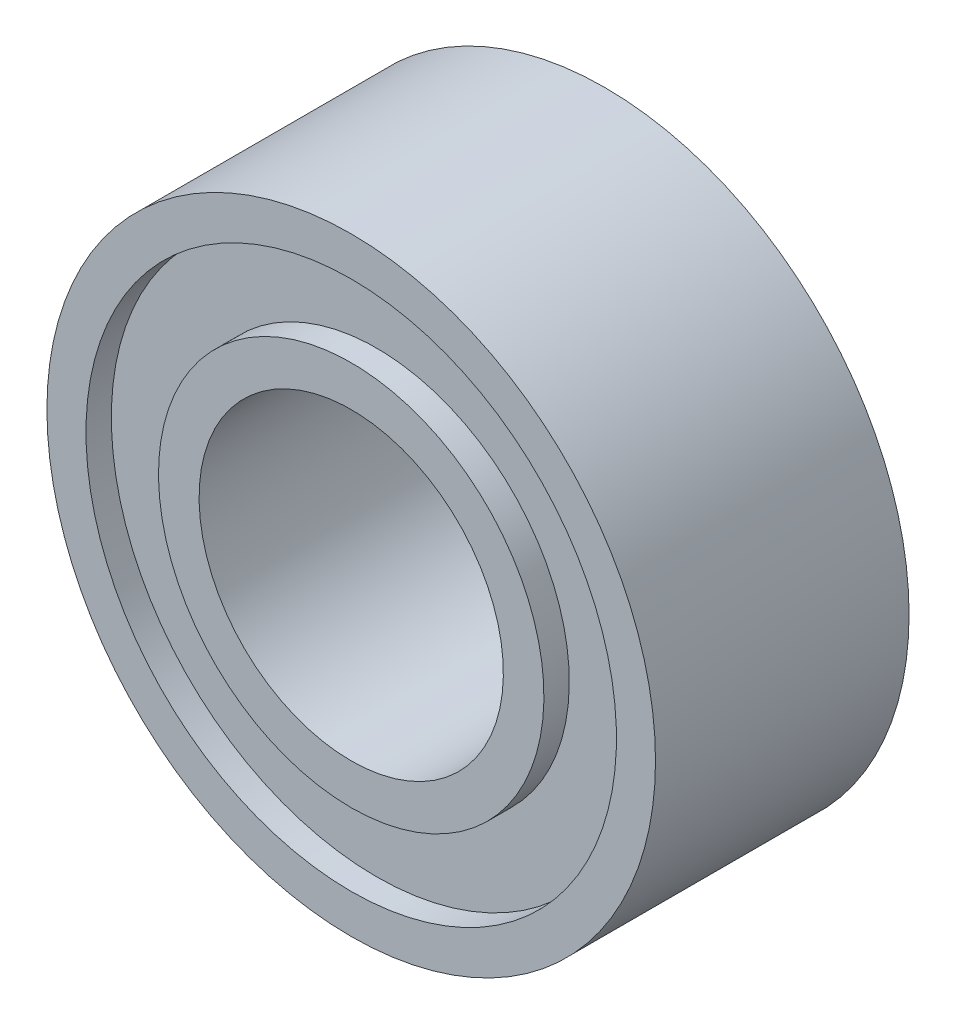
ISO-10303-21;
HEADER;
FILE_DESCRIPTION(('STEP AP214'),'2;1');
FILE_NAME('part.step','',(''),(''),'','','');
FILE_SCHEMA(('AUTOMOTIVE_DESIGN { 1 0 10303 214 1 1 1 1 }'));
ENDSEC;
DATA;
#1=APPLICATION_CONTEXT('core data for automotive mechanical design processes');
#2=APPLICATION_PROTOCOL_DEFINITION('international standard','automotive_design',2000,#1);
#3=PRODUCT_CONTEXT('',#1,'mechanical');
#4=PRODUCT('Part','Part','',(#3));
#5=PRODUCT_RELATED_PRODUCT_CATEGORY('part','',(#4));
#6=PRODUCT_DEFINITION_FORMATION('','',#4);
#7=PRODUCT_DEFINITION_CONTEXT('part definition',#1,'design');
#8=PRODUCT_DEFINITION('design','',#6,#7);
#9=PRODUCT_DEFINITION_SHAPE('','',#8);
#10=(LENGTH_UNIT() NAMED_UNIT(*) SI_UNIT(.MILLI.,.METRE.));
#11=(NAMED_UNIT(*) PLANE_ANGLE_UNIT() SI_UNIT($,.RADIAN.));
#12=(NAMED_UNIT(*) SI_UNIT($,.STERADIAN.) SOLID_ANGLE_UNIT());
#13=UNCERTAINTY_MEASURE_WITH_UNIT(LENGTH_MEASURE(1.E-05),#10,'distance_accuracy_value','');
#14=(GEOMETRIC_REPRESENTATION_CONTEXT(3) GLOBAL_UNCERTAINTY_ASSIGNED_CONTEXT((#13)) GLOBAL_UNIT_ASSIGNED_CONTEXT((#10,
#11,#12)) REPRESENTATION_CONTEXT('',''));
#15=CARTESIAN_POINT('',(0.,0.,0.));
#16=DIRECTION('',(0.,0.,1.));
#17=DIRECTION('',(1.,0.,0.));
#18=AXIS2_PLACEMENT_3D('',#15,#16,#17);
#19=CARTESIAN_POINT('',(0.,3.,1.25));
#20=DIRECTION('',(0.,0.,-1.));
#21=DIRECTION('',(0.,1.,0.));
#22=AXIS2_PLACEMENT_3D('',#19,#20,#21);
#23=PLANE('',#22);
#24=CARTESIAN_POINT('',(0.,0.,1.25));
#25=DIRECTION('',(0.,0.,1.));
#26=DIRECTION('',(0.,-1.,0.));
#27=AXIS2_PLACEMENT_3D('',#24,#25,#26);
#28=CIRCLE('',#27,2.615);
#29=CARTESIAN_POINT('',(0.,-2.615,1.25));
#30=VERTEX_POINT('',#29);
#31=EDGE_CURVE('E10',#30,#30,#28,.T.);
#32=ORIENTED_EDGE('',*,*,#31,.F.);
#33=EDGE_LOOP('',(#32));
#34=FACE_BOUND('',#33,.T.);
#35=CARTESIAN_POINT('',(0.,0.,1.25));
#36=DIRECTION('',(0.,0.,1.));
#37=DIRECTION('',(0.,-1.,0.));
#38=AXIS2_PLACEMENT_3D('',#35,#36,#37);
#39=CIRCLE('',#38,3.);
#40=CARTESIAN_POINT('',(0.,-3.,1.25));
#41=VERTEX_POINT('',#40);
#42=EDGE_CURVE('E71',#41,#41,#39,.T.);
#43=ORIENTED_EDGE('',*,*,#42,.T.);
#44=EDGE_LOOP('',(#43));
#45=FACE_BOUND('',#44,.T.);
#46=ADVANCED_FACE('F31',(#34,#45),#23,.F.);
#47=CARTESIAN_POINT('',(0.,0.,1.25));
#48=DIRECTION('',(0.,0.,1.));
#49=DIRECTION('',(0.,-1.,0.));
#50=AXIS2_PLACEMENT_3D('',#47,#48,#49);
#51=CYLINDRICAL_SURFACE('',#50,2.615);
#52=CARTESIAN_POINT('',(0.,0.,1.));
#53=DIRECTION('',(0.,0.,1.));
#54=DIRECTION('',(0.,-1.,0.));
#55=AXIS2_PLACEMENT_3D('',#52,#53,#54);
#56=CIRCLE('',#55,2.615);
#57=CARTESIAN_POINT('',(0.,-2.615,0.999999999999999));
#58=VERTEX_POINT('',#57);
#59=EDGE_CURVE('E37',#58,#58,#56,.T.);
#60=ORIENTED_EDGE('',*,*,#59,.F.);
#61=EDGE_LOOP('',(#60));
#62=FACE_BOUND('',#61,.T.);
#63=ORIENTED_EDGE('',*,*,#31,.T.);
#64=EDGE_LOOP('',(#63));
#65=FACE_BOUND('',#64,.T.);
#66=ADVANCED_FACE('F132',(#62,#65),#51,.F.);
#67=CARTESIAN_POINT('',(0.,2.615,1.));
#68=DIRECTION('',(0.,0.,-1.));
#69=DIRECTION('',(0.,1.,0.));
#70=AXIS2_PLACEMENT_3D('',#67,#68,#69);
#71=PLANE('',#70);
#72=CARTESIAN_POINT('',(0.,0.,1.));
#73=DIRECTION('',(0.,0.,1.));
#74=DIRECTION('',(0.,-1.,0.));
#75=AXIS2_PLACEMENT_3D('',#72,#73,#74);
#76=CIRCLE('',#75,1.9);
#77=CARTESIAN_POINT('',(0.,-1.9,1.));
#78=VERTEX_POINT('',#77);
#79=EDGE_CURVE('E41',#78,#78,#76,.T.);
#80=ORIENTED_EDGE('',*,*,#79,.F.);
#81=EDGE_LOOP('',(#80));
#82=FACE_BOUND('',#81,.T.);
#83=ORIENTED_EDGE('',*,*,#59,.T.);
#84=EDGE_LOOP('',(#83));
#85=FACE_BOUND('',#84,.T.);
#86=ADVANCED_FACE('F127',(#82,#85),#71,.F.);
#87=CARTESIAN_POINT('',(0.,0.,1.25));
#88=DIRECTION('',(0.,0.,1.));
#89=DIRECTION('',(0.,-1.,0.));
#90=AXIS2_PLACEMENT_3D('',#87,#88,#89);
#91=CYLINDRICAL_SURFACE('',#90,1.9);
#92=CARTESIAN_POINT('',(0.,0.,1.25));
#93=DIRECTION('',(0.,0.,1.));
#94=DIRECTION('',(0.,-1.,0.));
#95=AXIS2_PLACEMENT_3D('',#92,#93,#94);
#96=CIRCLE('',#95,1.9);
#97=CARTESIAN_POINT('',(0.,-1.9,1.25));
#98=VERTEX_POINT('',#97);
#99=EDGE_CURVE('E45',#98,#98,#96,.T.);
#100=ORIENTED_EDGE('',*,*,#99,.F.);
#101=EDGE_LOOP('',(#100));
#102=FACE_BOUND('',#101,.T.);
#103=ORIENTED_EDGE('',*,*,#79,.T.);
#104=EDGE_LOOP('',(#103));
#105=FACE_BOUND('',#104,.T.);
#106=ADVANCED_FACE('F121',(#102,#105),#91,.T.);
#107=CARTESIAN_POINT('',(0.,1.9,1.25));
#108=DIRECTION('',(0.,0.,-1.));
#109=DIRECTION('',(0.,1.,0.));
#110=AXIS2_PLACEMENT_3D('',#107,#108,#109);
#111=PLANE('',#110);
#112=CARTESIAN_POINT('',(0.,0.,1.25));
#113=DIRECTION('',(0.,0.,1.));
#114=DIRECTION('',(0.,-1.,0.));
#115=AXIS2_PLACEMENT_3D('',#112,#113,#114);
#116=CIRCLE('',#115,1.5);
#117=CARTESIAN_POINT('',(0.,-1.5,1.25));
#118=VERTEX_POINT('',#117);
#119=EDGE_CURVE('E50',#118,#118,#116,.T.);
#120=ORIENTED_EDGE('',*,*,#119,.F.);
#121=EDGE_LOOP('',(#120));
#122=FACE_BOUND('',#121,.T.);
#123=ORIENTED_EDGE('',*,*,#99,.T.);
#124=EDGE_LOOP('',(#123));
#125=FACE_BOUND('',#124,.T.);
#126=ADVANCED_FACE('F115',(#122,#125),#111,.F.);
#127=CARTESIAN_POINT('',(0.,0.,1.25));
#128=DIRECTION('',(0.,0.,1.));
#129=DIRECTION('',(0.,-1.,0.));
#130=AXIS2_PLACEMENT_3D('',#127,#128,#129);
#131=CYLINDRICAL_SURFACE('',#130,1.5);
#132=CARTESIAN_POINT('',(0.,0.,-1.25));
#133=DIRECTION('',(0.,0.,1.));
#134=DIRECTION('',(0.,-1.,0.));
#135=AXIS2_PLACEMENT_3D('',#132,#133,#134);
#136=CIRCLE('',#135,1.5);
#137=CARTESIAN_POINT('',(0.,-1.5,-1.25));
#138=VERTEX_POINT('',#137);
#139=EDGE_CURVE('E53',#138,#138,#136,.T.);
#140=ORIENTED_EDGE('',*,*,#139,.F.);
#141=EDGE_LOOP('',(#140));
#142=FACE_BOUND('',#141,.T.);
#143=ORIENTED_EDGE('',*,*,#119,.T.);
#144=EDGE_LOOP('',(#143));
#145=FACE_BOUND('',#144,.T.);
#146=ADVANCED_FACE('F109',(#142,#145),#131,.F.);
#147=CARTESIAN_POINT('',(0.,1.9,-1.25));
#148=DIRECTION('',(0.,0.,1.));
#149=DIRECTION('',(0.,-1.,0.));
#150=AXIS2_PLACEMENT_3D('',#147,#148,#149);
#151=PLANE('',#150);
#152=CARTESIAN_POINT('',(0.,0.,-1.25));
#153=DIRECTION('',(0.,0.,1.));
#154=DIRECTION('',(0.,-1.,0.));
#155=AXIS2_PLACEMENT_3D('',#152,#153,#154);
#156=CIRCLE('',#155,1.9);
#157=CARTESIAN_POINT('',(0.,-1.9,-1.25));
#158=VERTEX_POINT('',#157);
#159=EDGE_CURVE('E56',#158,#158,#156,.T.);
#160=ORIENTED_EDGE('',*,*,#159,.F.);
#161=EDGE_LOOP('',(#160));
#162=FACE_BOUND('',#161,.T.);
#163=ORIENTED_EDGE('',*,*,#139,.T.);
#164=EDGE_LOOP('',(#163));
#165=FACE_BOUND('',#164,.T.);
#166=ADVANCED_FACE('F103',(#162,#165),#151,.F.);
#167=CARTESIAN_POINT('',(0.,0.,1.25));
#168=DIRECTION('',(0.,0.,1.));
#169=DIRECTION('',(0.,-1.,0.));
#170=AXIS2_PLACEMENT_3D('',#167,#168,#169);
#171=CYLINDRICAL_SURFACE('',#170,1.9);
#172=CARTESIAN_POINT('',(0.,0.,-1.));
#173=DIRECTION('',(0.,0.,1.));
#174=DIRECTION('',(0.,-1.,0.));
#175=AXIS2_PLACEMENT_3D('',#172,#173,#174);
#176=CIRCLE('',#175,1.9);
#177=CARTESIAN_POINT('',(0.,-1.9,-1.));
#178=VERTEX_POINT('',#177);
#179=EDGE_CURVE('E59',#178,#178,#176,.T.);
#180=ORIENTED_EDGE('',*,*,#179,.F.);
#181=EDGE_LOOP('',(#180));
#182=FACE_BOUND('',#181,.T.);
#183=ORIENTED_EDGE('',*,*,#159,.T.);
#184=EDGE_LOOP('',(#183));
#185=FACE_BOUND('',#184,.T.);
#186=ADVANCED_FACE('F97',(#182,#185),#171,.T.);
#187=CARTESIAN_POINT('',(0.,2.615,-1.));
#188=DIRECTION('',(0.,0.,1.));
#189=DIRECTION('',(0.,-1.,0.));
#190=AXIS2_PLACEMENT_3D('',#187,#188,#189);
#191=PLANE('',#190);
#192=CARTESIAN_POINT('',(0.,0.,-1.));
#193=DIRECTION('',(0.,0.,1.));
#194=DIRECTION('',(0.,-1.,0.));
#195=AXIS2_PLACEMENT_3D('',#192,#193,#194);
#196=CIRCLE('',#195,2.615);
#197=CARTESIAN_POINT('',(0.,-2.615,-1.));
#198=VERTEX_POINT('',#197);
#199=EDGE_CURVE('E62',#198,#198,#196,.T.);
#200=ORIENTED_EDGE('',*,*,#199,.F.);
#201=EDGE_LOOP('',(#200));
#202=FACE_BOUND('',#201,.T.);
#203=ORIENTED_EDGE('',*,*,#179,.T.);
#204=EDGE_LOOP('',(#203));
#205=FACE_BOUND('',#204,.T.);
#206=ADVANCED_FACE('F91',(#202,#205),#191,.F.);
#207=CARTESIAN_POINT('',(0.,0.,1.25));
#208=DIRECTION('',(0.,0.,1.));
#209=DIRECTION('',(0.,-1.,0.));
#210=AXIS2_PLACEMENT_3D('',#207,#208,#209);
#211=CYLINDRICAL_SURFACE('',#210,2.615);
#212=CARTESIAN_POINT('',(0.,0.,-1.25));
#213=DIRECTION('',(0.,0.,1.));
#214=DIRECTION('',(0.,-1.,0.));
#215=AXIS2_PLACEMENT_3D('',#212,#213,#214);
#216=CIRCLE('',#215,2.615);
#217=CARTESIAN_POINT('',(0.,-2.615,-1.25));
#218=VERTEX_POINT('',#217);
#219=EDGE_CURVE('E65',#218,#218,#216,.T.);
#220=ORIENTED_EDGE('',*,*,#219,.F.);
#221=EDGE_LOOP('',(#220));
#222=FACE_BOUND('',#221,.T.);
#223=ORIENTED_EDGE('',*,*,#199,.T.);
#224=EDGE_LOOP('',(#223));
#225=FACE_BOUND('',#224,.T.);
#226=ADVANCED_FACE('F85',(#222,#225),#211,.F.);
#227=CARTESIAN_POINT('',(0.,3.,-1.25));
#228=DIRECTION('',(0.,0.,1.));
#229=DIRECTION('',(0.,-1.,0.));
#230=AXIS2_PLACEMENT_3D('',#227,#228,#229);
#231=PLANE('',#230);
#232=CARTESIAN_POINT('',(0.,0.,-1.25));
#233=DIRECTION('',(0.,0.,1.));
#234=DIRECTION('',(0.,-1.,0.));
#235=AXIS2_PLACEMENT_3D('',#232,#233,#234);
#236=CIRCLE('',#235,3.);
#237=CARTESIAN_POINT('',(0.,-3.,-1.25));
#238=VERTEX_POINT('',#237);
#239=EDGE_CURVE('E68',#238,#238,#236,.T.);
#240=ORIENTED_EDGE('',*,*,#239,.F.);
#241=EDGE_LOOP('',(#240));
#242=FACE_BOUND('',#241,.T.);
#243=ORIENTED_EDGE('',*,*,#219,.T.);
#244=EDGE_LOOP('',(#243));
#245=FACE_BOUND('',#244,.T.);
#246=ADVANCED_FACE('F79',(#242,#245),#231,.F.);
#247=CARTESIAN_POINT('',(0.,0.,1.25));
#248=DIRECTION('',(0.,0.,1.));
#249=DIRECTION('',(0.,-1.,0.));
#250=AXIS2_PLACEMENT_3D('',#247,#248,#249);
#251=CYLINDRICAL_SURFACE('',#250,3.);
#252=ORIENTED_EDGE('',*,*,#42,.F.);
#253=EDGE_LOOP('',(#252));
#254=FACE_BOUND('',#253,.T.);
#255=ORIENTED_EDGE('',*,*,#239,.T.);
#256=EDGE_LOOP('',(#255));
#257=FACE_BOUND('',#256,.T.);
#258=ADVANCED_FACE('F76',(#254,#257),#251,.T.);
#259=CLOSED_SHELL('',(#46,#66,#86,#106,#126,#146,#166,#186,#206,#226,#246,#258));
#260=MANIFOLD_SOLID_BREP('B2',#259);
#261=ADVANCED_BREP_SHAPE_REPRESENTATION('',(#18,#260),#14);
#262=SHAPE_DEFINITION_REPRESENTATION(#9,#261);
ENDSEC;
END-ISO-10303-21;
